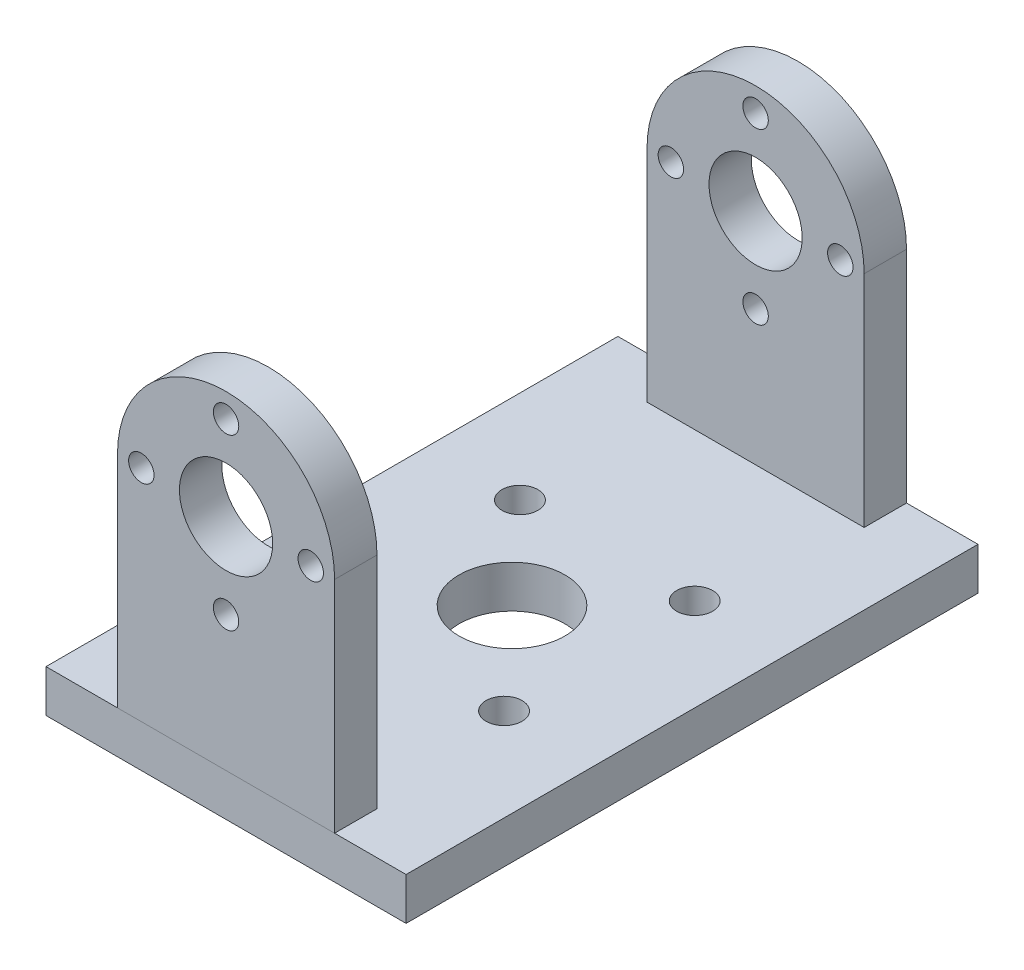
ISO-10303-21;
HEADER;
FILE_DESCRIPTION(('STEP AP214'),'2;1');
FILE_NAME('part.step','',(''),(''),'','','');
FILE_SCHEMA(('AUTOMOTIVE_DESIGN { 1 0 10303 214 1 1 1 1 }'));
ENDSEC;
DATA;
#1=APPLICATION_CONTEXT('core data for automotive mechanical design processes');
#2=APPLICATION_PROTOCOL_DEFINITION('international standard','automotive_design',2000,#1);
#3=PRODUCT_CONTEXT('',#1,'mechanical');
#4=PRODUCT('Part','Part','',(#3));
#5=PRODUCT_RELATED_PRODUCT_CATEGORY('part','',(#4));
#6=PRODUCT_DEFINITION_FORMATION('','',#4);
#7=PRODUCT_DEFINITION_CONTEXT('part definition',#1,'design');
#8=PRODUCT_DEFINITION('design','',#6,#7);
#9=PRODUCT_DEFINITION_SHAPE('','',#8);
#10=(LENGTH_UNIT() NAMED_UNIT(*) SI_UNIT(.MILLI.,.METRE.));
#11=(NAMED_UNIT(*) PLANE_ANGLE_UNIT() SI_UNIT($,.RADIAN.));
#12=(NAMED_UNIT(*) SI_UNIT($,.STERADIAN.) SOLID_ANGLE_UNIT());
#13=UNCERTAINTY_MEASURE_WITH_UNIT(LENGTH_MEASURE(1.E-05),#10,'distance_accuracy_value','');
#14=(GEOMETRIC_REPRESENTATION_CONTEXT(3) GLOBAL_UNCERTAINTY_ASSIGNED_CONTEXT((#13)) GLOBAL_UNIT_ASSIGNED_CONTEXT((#10,
#11,#12)) REPRESENTATION_CONTEXT('',''));
#15=CARTESIAN_POINT('',(0.,0.,0.));
#16=DIRECTION('',(0.,0.,1.));
#17=DIRECTION('',(1.,0.,0.));
#18=AXIS2_PLACEMENT_3D('',#15,#16,#17);
#19=CARTESIAN_POINT('',(0.,0.,50.));
#20=DIRECTION('',(0.,0.,1.));
#21=DIRECTION('',(1.,0.,0.));
#22=AXIS2_PLACEMENT_3D('',#19,#20,#21);
#23=PLANE('',#22);
#24=CARTESIAN_POINT('',(-8.,0.,50.));
#25=DIRECTION('',(0.,0.,1.));
#26=DIRECTION('',(1.,0.,0.));
#27=AXIS2_PLACEMENT_3D('',#24,#25,#26);
#28=CIRCLE('',#27,1.2);
#29=CARTESIAN_POINT('',(-6.8,0.,50.));
#30=VERTEX_POINT('',#29);
#31=EDGE_CURVE('E151',#30,#30,#28,.T.);
#32=ORIENTED_EDGE('',*,*,#31,.F.);
#33=EDGE_LOOP('',(#32));
#34=FACE_BOUND('',#33,.T.);
#35=CARTESIAN_POINT('',(8.,0.,50.));
#36=DIRECTION('',(0.,0.,1.));
#37=DIRECTION('',(1.,0.,0.));
#38=AXIS2_PLACEMENT_3D('',#35,#36,#37);
#39=CIRCLE('',#38,1.2);
#40=CARTESIAN_POINT('',(9.2,0.,50.));
#41=VERTEX_POINT('',#40);
#42=EDGE_CURVE('E139',#41,#41,#39,.T.);
#43=ORIENTED_EDGE('',*,*,#42,.F.);
#44=EDGE_LOOP('',(#43));
#45=FACE_BOUND('',#44,.T.);
#46=DIRECTION('',(0.,1.,0.));
#47=VECTOR('',#46,1.);
#48=CARTESIAN_POINT('',(10.25,-20.75,50.));
#49=LINE('',#48,#47);
#50=CARTESIAN_POINT('',(10.25,-20.75,50.));
#51=VERTEX_POINT('',#50);
#52=CARTESIAN_POINT('',(10.25,0.,50.));
#53=VERTEX_POINT('',#52);
#54=EDGE_CURVE('E109',#51,#53,#49,.T.);
#55=ORIENTED_EDGE('',*,*,#54,.T.);
#56=CARTESIAN_POINT('',(0.,0.,50.));
#57=DIRECTION('',(0.,0.,1.));
#58=DIRECTION('',(1.,0.,0.));
#59=AXIS2_PLACEMENT_3D('',#56,#57,#58);
#60=CIRCLE('',#59,10.25);
#61=CARTESIAN_POINT('',(-10.25,0.,50.));
#62=VERTEX_POINT('',#61);
#63=EDGE_CURVE('E104',#53,#62,#60,.T.);
#64=ORIENTED_EDGE('',*,*,#63,.T.);
#65=DIRECTION('',(0.,-1.,0.));
#66=VECTOR('',#65,1.);
#67=CARTESIAN_POINT('',(-10.25,-20.75,50.));
#68=LINE('',#67,#66);
#69=CARTESIAN_POINT('',(-10.25,-20.75,50.));
#70=VERTEX_POINT('',#69);
#71=EDGE_CURVE('E107',#62,#70,#68,.T.);
#72=ORIENTED_EDGE('',*,*,#71,.T.);
#73=DIRECTION('',(1.,0.,0.));
#74=VECTOR('',#73,1.);
#75=CARTESIAN_POINT('',(10.25,-20.75,50.));
#76=LINE('',#75,#74);
#77=EDGE_CURVE('E74',#70,#51,#76,.T.);
#78=ORIENTED_EDGE('',*,*,#77,.T.);
#79=EDGE_LOOP('',(#55,#64,#72,#78));
#80=FACE_BOUND('',#79,.T.);
#81=CARTESIAN_POINT('',(0.,0.,50.));
#82=DIRECTION('',(0.,0.,1.));
#83=DIRECTION('',(1.,0.,0.));
#84=AXIS2_PLACEMENT_3D('',#81,#82,#83);
#85=CIRCLE('',#84,4.4);
#86=CARTESIAN_POINT('',(4.4,0.,50.));
#87=VERTEX_POINT('',#86);
#88=EDGE_CURVE('E124',#87,#87,#85,.T.);
#89=ORIENTED_EDGE('',*,*,#88,.F.);
#90=EDGE_LOOP('',(#89));
#91=FACE_BOUND('',#90,.T.);
#92=CARTESIAN_POINT('',(0.,-8.,50.));
#93=DIRECTION('',(0.,0.,1.));
#94=DIRECTION('',(1.,0.,0.));
#95=AXIS2_PLACEMENT_3D('',#92,#93,#94);
#96=CIRCLE('',#95,1.2);
#97=CARTESIAN_POINT('',(1.19999999999995,-8.,50.));
#98=VERTEX_POINT('',#97);
#99=EDGE_CURVE('E145',#98,#98,#96,.T.);
#100=ORIENTED_EDGE('',*,*,#99,.F.);
#101=EDGE_LOOP('',(#100));
#102=FACE_BOUND('',#101,.T.);
#103=CARTESIAN_POINT('',(1.1172740284298E-13,8.,50.));
#104=DIRECTION('',(0.,0.,1.));
#105=DIRECTION('',(1.,0.,0.));
#106=AXIS2_PLACEMENT_3D('',#103,#104,#105);
#107=CIRCLE('',#106,1.2);
#108=CARTESIAN_POINT('',(1.20000000000011,8.,50.));
#109=VERTEX_POINT('',#108);
#110=EDGE_CURVE('E157',#109,#109,#107,.T.);
#111=ORIENTED_EDGE('',*,*,#110,.F.);
#112=EDGE_LOOP('',(#111));
#113=FACE_BOUND('',#112,.T.);
#114=ADVANCED_FACE('F57',(#34,#45,#80,#91,#102,#113),#23,.T.);
#115=CARTESIAN_POINT('',(0.,0.,46.));
#116=DIRECTION('',(0.,0.,1.));
#117=DIRECTION('',(1.,0.,0.));
#118=AXIS2_PLACEMENT_3D('',#115,#116,#117);
#119=PLANE('',#118);
#120=DIRECTION('',(0.,1.,0.));
#121=VECTOR('',#120,1.);
#122=CARTESIAN_POINT('',(10.25,-20.75,46.));
#123=LINE('',#122,#121);
#124=CARTESIAN_POINT('',(10.25,-20.75,46.));
#125=VERTEX_POINT('',#124);
#126=CARTESIAN_POINT('',(10.25,0.,46.));
#127=VERTEX_POINT('',#126);
#128=EDGE_CURVE('E121',#125,#127,#123,.T.);
#129=ORIENTED_EDGE('',*,*,#128,.F.);
#130=DIRECTION('',(1.,0.,0.));
#131=VECTOR('',#130,1.);
#132=CARTESIAN_POINT('',(10.25,-20.75,46.));
#133=LINE('',#132,#131);
#134=CARTESIAN_POINT('',(-10.25,-20.75,46.));
#135=VERTEX_POINT('',#134);
#136=EDGE_CURVE('E97',#135,#125,#133,.T.);
#137=ORIENTED_EDGE('',*,*,#136,.F.);
#138=DIRECTION('',(0.,-1.,0.));
#139=VECTOR('',#138,1.);
#140=CARTESIAN_POINT('',(-10.25,-20.75,46.));
#141=LINE('',#140,#139);
#142=CARTESIAN_POINT('',(-10.25,0.,46.));
#143=VERTEX_POINT('',#142);
#144=EDGE_CURVE('E91',#143,#135,#141,.T.);
#145=ORIENTED_EDGE('',*,*,#144,.F.);
#146=CARTESIAN_POINT('',(0.,0.,46.));
#147=DIRECTION('',(0.,0.,1.));
#148=DIRECTION('',(1.,0.,0.));
#149=AXIS2_PLACEMENT_3D('',#146,#147,#148);
#150=CIRCLE('',#149,10.25);
#151=EDGE_CURVE('E113',#127,#143,#150,.T.);
#152=ORIENTED_EDGE('',*,*,#151,.F.);
#153=EDGE_LOOP('',(#129,#137,#145,#152));
#154=FACE_BOUND('',#153,.T.);
#155=CARTESIAN_POINT('',(0.,0.,46.));
#156=DIRECTION('',(0.,0.,1.));
#157=DIRECTION('',(1.,0.,0.));
#158=AXIS2_PLACEMENT_3D('',#155,#156,#157);
#159=CIRCLE('',#158,4.4);
#160=CARTESIAN_POINT('',(4.4,0.,46.));
#161=VERTEX_POINT('',#160);
#162=EDGE_CURVE('E136',#161,#161,#159,.T.);
#163=ORIENTED_EDGE('',*,*,#162,.T.);
#164=EDGE_LOOP('',(#163));
#165=FACE_BOUND('',#164,.T.);
#166=CARTESIAN_POINT('',(8.,0.,46.));
#167=DIRECTION('',(0.,0.,1.));
#168=DIRECTION('',(1.,0.,0.));
#169=AXIS2_PLACEMENT_3D('',#166,#167,#168);
#170=CIRCLE('',#169,1.2);
#171=CARTESIAN_POINT('',(9.2,0.,46.));
#172=VERTEX_POINT('',#171);
#173=EDGE_CURVE('E142',#172,#172,#170,.T.);
#174=ORIENTED_EDGE('',*,*,#173,.T.);
#175=EDGE_LOOP('',(#174));
#176=FACE_BOUND('',#175,.T.);
#177=CARTESIAN_POINT('',(0.,-8.,46.));
#178=DIRECTION('',(0.,0.,1.));
#179=DIRECTION('',(1.,0.,0.));
#180=AXIS2_PLACEMENT_3D('',#177,#178,#179);
#181=CIRCLE('',#180,1.2);
#182=CARTESIAN_POINT('',(1.19999999999995,-8.,46.));
#183=VERTEX_POINT('',#182);
#184=EDGE_CURVE('E148',#183,#183,#181,.T.);
#185=ORIENTED_EDGE('',*,*,#184,.T.);
#186=EDGE_LOOP('',(#185));
#187=FACE_BOUND('',#186,.T.);
#188=CARTESIAN_POINT('',(-8.,0.,46.));
#189=DIRECTION('',(0.,0.,1.));
#190=DIRECTION('',(1.,0.,0.));
#191=AXIS2_PLACEMENT_3D('',#188,#189,#190);
#192=CIRCLE('',#191,1.2);
#193=CARTESIAN_POINT('',(-6.8,0.,46.));
#194=VERTEX_POINT('',#193);
#195=EDGE_CURVE('E154',#194,#194,#192,.T.);
#196=ORIENTED_EDGE('',*,*,#195,.T.);
#197=EDGE_LOOP('',(#196));
#198=FACE_BOUND('',#197,.T.);
#199=CARTESIAN_POINT('',(1.1172740284298E-13,8.,46.));
#200=DIRECTION('',(0.,0.,1.));
#201=DIRECTION('',(1.,0.,0.));
#202=AXIS2_PLACEMENT_3D('',#199,#200,#201);
#203=CIRCLE('',#202,1.2);
#204=CARTESIAN_POINT('',(1.20000000000011,8.,46.));
#205=VERTEX_POINT('',#204);
#206=EDGE_CURVE('E160',#205,#205,#203,.T.);
#207=ORIENTED_EDGE('',*,*,#206,.T.);
#208=EDGE_LOOP('',(#207));
#209=FACE_BOUND('',#208,.T.);
#210=ADVANCED_FACE('F132',(#154,#165,#176,#187,#198,#209),#119,.F.);
#211=CARTESIAN_POINT('',(10.25,-20.75,50.));
#212=DIRECTION('',(-1.,0.,0.));
#213=DIRECTION('',(0.,0.,1.));
#214=AXIS2_PLACEMENT_3D('',#211,#212,#213);
#215=PLANE('',#214);
#216=ORIENTED_EDGE('',*,*,#128,.T.);
#217=DIRECTION('',(0.,0.,-1.));
#218=VECTOR('',#217,1.);
#219=CARTESIAN_POINT('',(10.25,0.,50.));
#220=LINE('',#219,#218);
#221=EDGE_CURVE('E12',#53,#127,#220,.T.);
#222=ORIENTED_EDGE('',*,*,#221,.F.);
#223=ORIENTED_EDGE('',*,*,#54,.F.);
#224=DIRECTION('',(0.,0.,-1.));
#225=VECTOR('',#224,1.);
#226=CARTESIAN_POINT('',(10.25,-20.75,50.));
#227=LINE('',#226,#225);
#228=EDGE_CURVE('E117',#51,#125,#227,.T.);
#229=ORIENTED_EDGE('',*,*,#228,.T.);
#230=EDGE_LOOP('',(#216,#222,#223,#229));
#231=FACE_BOUND('',#230,.T.);
#232=ADVANCED_FACE('F59',(#231),#215,.F.);
#233=CARTESIAN_POINT('',(0.,0.,50.));
#234=DIRECTION('',(0.,0.,-1.));
#235=DIRECTION('',(-1.,0.,0.));
#236=AXIS2_PLACEMENT_3D('',#233,#234,#235);
#237=CYLINDRICAL_SURFACE('',#236,10.25);
#238=ORIENTED_EDGE('',*,*,#151,.T.);
#239=DIRECTION('',(0.,0.,-1.));
#240=VECTOR('',#239,1.);
#241=CARTESIAN_POINT('',(-10.25,0.,50.));
#242=LINE('',#241,#240);
#243=EDGE_CURVE('E66',#62,#143,#242,.T.);
#244=ORIENTED_EDGE('',*,*,#243,.F.);
#245=ORIENTED_EDGE('',*,*,#63,.F.);
#246=ORIENTED_EDGE('',*,*,#221,.T.);
#247=EDGE_LOOP('',(#238,#244,#245,#246));
#248=FACE_BOUND('',#247,.T.);
#249=ADVANCED_FACE('F112',(#248),#237,.T.);
#250=CARTESIAN_POINT('',(-10.25,-20.75,50.));
#251=DIRECTION('',(1.,0.,0.));
#252=DIRECTION('',(0.,0.,-1.));
#253=AXIS2_PLACEMENT_3D('',#250,#251,#252);
#254=PLANE('',#253);
#255=ORIENTED_EDGE('',*,*,#144,.T.);
#256=DIRECTION('',(0.,0.,-1.));
#257=VECTOR('',#256,1.);
#258=CARTESIAN_POINT('',(-10.25,-20.75,50.));
#259=LINE('',#258,#257);
#260=EDGE_CURVE('E114',#70,#135,#259,.T.);
#261=ORIENTED_EDGE('',*,*,#260,.F.);
#262=ORIENTED_EDGE('',*,*,#71,.F.);
#263=ORIENTED_EDGE('',*,*,#243,.T.);
#264=EDGE_LOOP('',(#255,#261,#262,#263));
#265=FACE_BOUND('',#264,.T.);
#266=ADVANCED_FACE('F115',(#265),#254,.F.);
#267=CARTESIAN_POINT('',(10.25,-20.75,50.));
#268=DIRECTION('',(0.,1.,0.));
#269=DIRECTION('',(0.,0.,1.));
#270=AXIS2_PLACEMENT_3D('',#267,#268,#269);
#271=PLANE('',#270);
#272=ORIENTED_EDGE('',*,*,#136,.T.);
#273=ORIENTED_EDGE('',*,*,#228,.F.);
#274=ORIENTED_EDGE('',*,*,#77,.F.);
#275=ORIENTED_EDGE('',*,*,#260,.T.);
#276=EDGE_LOOP('',(#272,#273,#274,#275));
#277=FACE_BOUND('',#276,.T.);
#278=ADVANCED_FACE('F129',(#277),#271,.F.);
#279=CARTESIAN_POINT('',(0.,0.,50.));
#280=DIRECTION('',(0.,0.,-1.));
#281=DIRECTION('',(-1.,0.,0.));
#282=AXIS2_PLACEMENT_3D('',#279,#280,#281);
#283=CYLINDRICAL_SURFACE('',#282,4.4);
#284=ORIENTED_EDGE('',*,*,#88,.T.);
#285=EDGE_LOOP('',(#284));
#286=FACE_BOUND('',#285,.T.);
#287=ORIENTED_EDGE('',*,*,#162,.F.);
#288=EDGE_LOOP('',(#287));
#289=FACE_BOUND('',#288,.T.);
#290=ADVANCED_FACE('F180',(#286,#289),#283,.F.);
#291=CARTESIAN_POINT('',(8.,0.,50.));
#292=DIRECTION('',(0.,0.,-1.));
#293=DIRECTION('',(-1.,0.,0.));
#294=AXIS2_PLACEMENT_3D('',#291,#292,#293);
#295=CYLINDRICAL_SURFACE('',#294,1.2);
#296=ORIENTED_EDGE('',*,*,#42,.T.);
#297=EDGE_LOOP('',(#296));
#298=FACE_BOUND('',#297,.T.);
#299=ORIENTED_EDGE('',*,*,#173,.F.);
#300=EDGE_LOOP('',(#299));
#301=FACE_BOUND('',#300,.T.);
#302=ADVANCED_FACE('F209',(#298,#301),#295,.F.);
#303=CARTESIAN_POINT('',(0.,-8.,50.));
#304=DIRECTION('',(0.,0.,-1.));
#305=DIRECTION('',(-1.,0.,0.));
#306=AXIS2_PLACEMENT_3D('',#303,#304,#305);
#307=CYLINDRICAL_SURFACE('',#306,1.2);
#308=ORIENTED_EDGE('',*,*,#99,.T.);
#309=EDGE_LOOP('',(#308));
#310=FACE_BOUND('',#309,.T.);
#311=ORIENTED_EDGE('',*,*,#184,.F.);
#312=EDGE_LOOP('',(#311));
#313=FACE_BOUND('',#312,.T.);
#314=ADVANCED_FACE('F217',(#310,#313),#307,.F.);
#315=CARTESIAN_POINT('',(-8.,0.,50.));
#316=DIRECTION('',(0.,0.,-1.));
#317=DIRECTION('',(-1.,0.,0.));
#318=AXIS2_PLACEMENT_3D('',#315,#316,#317);
#319=CYLINDRICAL_SURFACE('',#318,1.2);
#320=ORIENTED_EDGE('',*,*,#31,.T.);
#321=EDGE_LOOP('',(#320));
#322=FACE_BOUND('',#321,.T.);
#323=ORIENTED_EDGE('',*,*,#195,.F.);
#324=EDGE_LOOP('',(#323));
#325=FACE_BOUND('',#324,.T.);
#326=ADVANCED_FACE('F225',(#322,#325),#319,.F.);
#327=CARTESIAN_POINT('',(1.1172740284298E-13,8.,50.));
#328=DIRECTION('',(0.,0.,-1.));
#329=DIRECTION('',(-1.,0.,0.));
#330=AXIS2_PLACEMENT_3D('',#327,#328,#329);
#331=CYLINDRICAL_SURFACE('',#330,1.2);
#332=ORIENTED_EDGE('',*,*,#110,.T.);
#333=EDGE_LOOP('',(#332));
#334=FACE_BOUND('',#333,.T.);
#335=ORIENTED_EDGE('',*,*,#206,.F.);
#336=EDGE_LOOP('',(#335));
#337=FACE_BOUND('',#336,.T.);
#338=ADVANCED_FACE('F166',(#334,#337),#331,.F.);
#339=CLOSED_SHELL('',(#114,#210,#232,#249,#266,#278,#290,#302,#314,#326,#338));
#340=MANIFOLD_SOLID_BREP('B2',#339);
#341=CARTESIAN_POINT('',(0.,-20.75,0.));
#342=DIRECTION('',(0.,1.,0.));
#343=DIRECTION('',(-1.,0.,0.));
#344=AXIS2_PLACEMENT_3D('',#341,#342,#343);
#345=PLANE('',#344);
#346=DIRECTION('',(0.,0.,-1.));
#347=VECTOR('',#346,1.);
#348=CARTESIAN_POINT('',(17.,-20.75,0.));
#349=LINE('',#348,#347);
#350=CARTESIAN_POINT('',(17.,-20.75,50.));
#351=VERTEX_POINT('',#350);
#352=CARTESIAN_POINT('',(17.,-20.75,-4.));
#353=VERTEX_POINT('',#352);
#354=EDGE_CURVE('E323',#351,#353,#349,.T.);
#355=ORIENTED_EDGE('',*,*,#354,.T.);
#356=DIRECTION('',(-1.,0.,0.));
#357=VECTOR('',#356,1.);
#358=CARTESIAN_POINT('',(-17.,-20.75,-4.));
#359=LINE('',#358,#357);
#360=CARTESIAN_POINT('',(10.25,-20.75,-4.));
#361=VERTEX_POINT('',#360);
#362=EDGE_CURVE('E352',#353,#361,#359,.T.);
#363=ORIENTED_EDGE('',*,*,#362,.T.);
#364=DIRECTION('',(0.,0.,1.));
#365=VECTOR('',#364,1.);
#366=CARTESIAN_POINT('',(10.25,-20.75,0.));
#367=LINE('',#366,#365);
#368=CARTESIAN_POINT('',(10.25,-20.75,0.));
#369=VERTEX_POINT('',#368);
#370=EDGE_CURVE('E300',#361,#369,#367,.T.);
#371=ORIENTED_EDGE('',*,*,#370,.T.);
#372=DIRECTION('',(1.,0.,0.));
#373=VECTOR('',#372,1.);
#374=CARTESIAN_POINT('',(-17.,-20.75,0.));
#375=LINE('',#374,#373);
#376=CARTESIAN_POINT('',(-10.25,-20.75,0.));
#377=VERTEX_POINT('',#376);
#378=EDGE_CURVE('E823',#377,#369,#375,.T.);
#379=ORIENTED_EDGE('',*,*,#378,.F.);
#380=DIRECTION('',(0.,0.,-1.));
#381=VECTOR('',#380,1.);
#382=CARTESIAN_POINT('',(-10.25,-20.75,0.));
#383=LINE('',#382,#381);
#384=CARTESIAN_POINT('',(-10.25,-20.75,-4.));
#385=VERTEX_POINT('',#384);
#386=EDGE_CURVE('E394',#377,#385,#383,.T.);
#387=ORIENTED_EDGE('',*,*,#386,.T.);
#388=CARTESIAN_POINT('',(-17.,-20.75,-4.));
#389=VERTEX_POINT('',#388);
#390=EDGE_CURVE('E357',#385,#389,#359,.T.);
#391=ORIENTED_EDGE('',*,*,#390,.T.);
#392=DIRECTION('',(0.,0.,1.));
#393=VECTOR('',#392,1.);
#394=CARTESIAN_POINT('',(-17.,-20.75,0.));
#395=LINE('',#394,#393);
#396=CARTESIAN_POINT('',(-17.,-20.75,50.));
#397=VERTEX_POINT('',#396);
#398=EDGE_CURVE('E349',#389,#397,#395,.T.);
#399=ORIENTED_EDGE('',*,*,#398,.T.);
#400=DIRECTION('',(1.,0.,0.));
#401=VECTOR('',#400,1.);
#402=CARTESIAN_POINT('',(-17.,-20.75,50.));
#403=LINE('',#402,#401);
#404=EDGE_CURVE('E340',#397,#351,#403,.T.);
#405=ORIENTED_EDGE('',*,*,#404,.T.);
#406=EDGE_LOOP('',(#355,#363,#371,#379,#387,#391,#399,#405));
#407=FACE_BOUND('',#406,.T.);
#408=CARTESIAN_POINT('',(8.25,-20.75,14.));
#409=DIRECTION('',(0.,1.,0.));
#410=DIRECTION('',(-1.,0.,0.));
#411=AXIS2_PLACEMENT_3D('',#408,#409,#410);
#412=CIRCLE('',#411,1.7);
#413=CARTESIAN_POINT('',(6.55,-20.75,14.));
#414=VERTEX_POINT('',#413);
#415=EDGE_CURVE('E385',#414,#414,#412,.F.);
#416=ORIENTED_EDGE('',*,*,#415,.T.);
#417=EDGE_LOOP('',(#416));
#418=FACE_BOUND('',#417,.T.);
#419=CARTESIAN_POINT('',(-8.25000000000019,-20.75,32.));
#420=DIRECTION('',(0.,1.,0.));
#421=DIRECTION('',(-1.,0.,0.));
#422=AXIS2_PLACEMENT_3D('',#419,#420,#421);
#423=CIRCLE('',#422,1.7);
#424=CARTESIAN_POINT('',(-9.95000000000019,-20.75,32.));
#425=VERTEX_POINT('',#424);
#426=EDGE_CURVE('E334',#425,#425,#423,.F.);
#427=ORIENTED_EDGE('',*,*,#426,.T.);
#428=EDGE_LOOP('',(#427));
#429=FACE_BOUND('',#428,.T.);
#430=CARTESIAN_POINT('',(8.24999999999981,-20.75,32.));
#431=DIRECTION('',(0.,1.,0.));
#432=DIRECTION('',(-1.,0.,0.));
#433=AXIS2_PLACEMENT_3D('',#430,#431,#432);
#434=CIRCLE('',#433,1.7);
#435=CARTESIAN_POINT('',(6.54999999999981,-20.75,32.));
#436=VERTEX_POINT('',#435);
#437=EDGE_CURVE('E400',#436,#436,#434,.F.);
#438=ORIENTED_EDGE('',*,*,#437,.T.);
#439=EDGE_LOOP('',(#438));
#440=FACE_BOUND('',#439,.T.);
#441=CARTESIAN_POINT('',(-8.25,-20.75,14.));
#442=DIRECTION('',(0.,1.,0.));
#443=DIRECTION('',(-1.,0.,0.));
#444=AXIS2_PLACEMENT_3D('',#441,#442,#443);
#445=CIRCLE('',#444,1.7);
#446=CARTESIAN_POINT('',(-9.95,-20.75,14.));
#447=VERTEX_POINT('',#446);
#448=EDGE_CURVE('E404',#447,#447,#445,.F.);
#449=ORIENTED_EDGE('',*,*,#448,.T.);
#450=EDGE_LOOP('',(#449));
#451=FACE_BOUND('',#450,.T.);
#452=CARTESIAN_POINT('',(0.,-20.75,23.));
#453=DIRECTION('',(0.,1.,0.));
#454=DIRECTION('',(-1.,0.,0.));
#455=AXIS2_PLACEMENT_3D('',#452,#453,#454);
#456=CIRCLE('',#455,5.);
#457=CARTESIAN_POINT('',(-5.00000000000001,-20.75,23.));
#458=VERTEX_POINT('',#457);
#459=EDGE_CURVE('E408',#458,#458,#456,.F.);
#460=ORIENTED_EDGE('',*,*,#459,.T.);
#461=EDGE_LOOP('',(#460));
#462=FACE_BOUND('',#461,.T.);
#463=ADVANCED_FACE('F282',(#407,#418,#429,#440,#451,#462),#345,.T.);
#464=CARTESIAN_POINT('',(17.,-24.75,0.));
#465=DIRECTION('',(0.,1.,0.));
#466=DIRECTION('',(-1.,0.,0.));
#467=AXIS2_PLACEMENT_3D('',#464,#465,#466);
#468=PLANE('',#467);
#469=DIRECTION('',(-1.,0.,0.));
#470=VECTOR('',#469,1.);
#471=CARTESIAN_POINT('',(-17.,-24.75,-4.));
#472=LINE('',#471,#470);
#473=CARTESIAN_POINT('',(17.,-24.75,-4.));
#474=VERTEX_POINT('',#473);
#475=CARTESIAN_POINT('',(-17.,-24.75,-4.));
#476=VERTEX_POINT('',#475);
#477=EDGE_CURVE('E533',#474,#476,#472,.T.);
#478=ORIENTED_EDGE('',*,*,#477,.F.);
#479=DIRECTION('',(0.,0.,-1.));
#480=VECTOR('',#479,1.);
#481=CARTESIAN_POINT('',(17.,-24.75,0.));
#482=LINE('',#481,#480);
#483=CARTESIAN_POINT('',(17.,-24.75,50.));
#484=VERTEX_POINT('',#483);
#485=EDGE_CURVE('E309',#484,#474,#482,.T.);
#486=ORIENTED_EDGE('',*,*,#485,.F.);
#487=DIRECTION('',(1.,0.,0.));
#488=VECTOR('',#487,1.);
#489=CARTESIAN_POINT('',(-17.,-24.75,50.));
#490=LINE('',#489,#488);
#491=CARTESIAN_POINT('',(-17.,-24.75,50.));
#492=VERTEX_POINT('',#491);
#493=EDGE_CURVE('E341',#492,#484,#490,.T.);
#494=ORIENTED_EDGE('',*,*,#493,.F.);
#495=DIRECTION('',(0.,0.,-1.));
#496=VECTOR('',#495,1.);
#497=CARTESIAN_POINT('',(-17.,-24.75,0.));
#498=LINE('',#497,#496);
#499=EDGE_CURVE('E343',#492,#476,#498,.T.);
#500=ORIENTED_EDGE('',*,*,#499,.T.);
#501=EDGE_LOOP('',(#478,#486,#494,#500));
#502=FACE_BOUND('',#501,.T.);
#503=CARTESIAN_POINT('',(0.,-24.75,23.));
#504=DIRECTION('',(0.,1.,0.));
#505=DIRECTION('',(-1.,0.,0.));
#506=AXIS2_PLACEMENT_3D('',#503,#504,#505);
#507=CIRCLE('',#506,5.);
#508=CARTESIAN_POINT('',(-5.,-24.75,23.));
#509=VERTEX_POINT('',#508);
#510=EDGE_CURVE('E381',#509,#509,#507,.F.);
#511=ORIENTED_EDGE('',*,*,#510,.F.);
#512=EDGE_LOOP('',(#511));
#513=FACE_BOUND('',#512,.T.);
#514=CARTESIAN_POINT('',(-8.25,-24.75,14.));
#515=DIRECTION('',(0.,1.,0.));
#516=DIRECTION('',(-1.,0.,0.));
#517=AXIS2_PLACEMENT_3D('',#514,#515,#516);
#518=CIRCLE('',#517,1.7);
#519=CARTESIAN_POINT('',(-9.95,-24.75,14.));
#520=VERTEX_POINT('',#519);
#521=EDGE_CURVE('E373',#520,#520,#518,.F.);
#522=ORIENTED_EDGE('',*,*,#521,.F.);
#523=EDGE_LOOP('',(#522));
#524=FACE_BOUND('',#523,.T.);
#525=CARTESIAN_POINT('',(8.24999999999981,-24.75,32.));
#526=DIRECTION('',(0.,1.,0.));
#527=DIRECTION('',(-1.,0.,0.));
#528=AXIS2_PLACEMENT_3D('',#525,#526,#527);
#529=CIRCLE('',#528,1.7);
#530=CARTESIAN_POINT('',(6.54999999999981,-24.75,32.));
#531=VERTEX_POINT('',#530);
#532=EDGE_CURVE('E365',#531,#531,#529,.F.);
#533=ORIENTED_EDGE('',*,*,#532,.F.);
#534=EDGE_LOOP('',(#533));
#535=FACE_BOUND('',#534,.T.);
#536=CARTESIAN_POINT('',(-8.25000000000019,-24.75,32.));
#537=DIRECTION('',(0.,1.,0.));
#538=DIRECTION('',(-1.,0.,0.));
#539=AXIS2_PLACEMENT_3D('',#536,#537,#538);
#540=CIRCLE('',#539,1.7);
#541=CARTESIAN_POINT('',(-9.95000000000019,-24.75,32.));
#542=VERTEX_POINT('',#541);
#543=EDGE_CURVE('E369',#542,#542,#540,.F.);
#544=ORIENTED_EDGE('',*,*,#543,.F.);
#545=EDGE_LOOP('',(#544));
#546=FACE_BOUND('',#545,.T.);
#547=CARTESIAN_POINT('',(8.25,-24.75,14.));
#548=DIRECTION('',(0.,1.,0.));
#549=DIRECTION('',(-1.,0.,0.));
#550=AXIS2_PLACEMENT_3D('',#547,#548,#549);
#551=CIRCLE('',#550,1.7);
#552=CARTESIAN_POINT('',(6.55,-24.75,14.));
#553=VERTEX_POINT('',#552);
#554=EDGE_CURVE('E377',#553,#553,#551,.F.);
#555=ORIENTED_EDGE('',*,*,#554,.F.);
#556=EDGE_LOOP('',(#555));
#557=FACE_BOUND('',#556,.T.);
#558=ADVANCED_FACE('F421',(#502,#513,#524,#535,#546,#557),#468,.F.);
#559=CARTESIAN_POINT('',(10.25,0.,4.));
#560=DIRECTION('',(1.,0.,0.));
#561=DIRECTION('',(0.,1.,0.));
#562=AXIS2_PLACEMENT_3D('',#559,#560,#561);
#563=PLANE('',#562);
#564=DIRECTION('',(0.,1.,0.));
#565=VECTOR('',#564,1.);
#566=CARTESIAN_POINT('',(10.25,0.,0.));
#567=LINE('',#566,#565);
#568=CARTESIAN_POINT('',(10.25,0.,0.));
#569=VERTEX_POINT('',#568);
#570=EDGE_CURVE('E507',#369,#569,#567,.T.);
#571=ORIENTED_EDGE('',*,*,#570,.F.);
#572=ORIENTED_EDGE('',*,*,#370,.F.);
#573=DIRECTION('',(0.,-1.,0.));
#574=VECTOR('',#573,1.);
#575=CARTESIAN_POINT('',(10.25,0.,-4.));
#576=LINE('',#575,#574);
#577=CARTESIAN_POINT('',(10.25,0.,-4.));
#578=VERTEX_POINT('',#577);
#579=EDGE_CURVE('E518',#578,#361,#576,.T.);
#580=ORIENTED_EDGE('',*,*,#579,.F.);
#581=DIRECTION('',(0.,0.,-1.));
#582=VECTOR('',#581,1.);
#583=CARTESIAN_POINT('',(10.25,0.,4.));
#584=LINE('',#583,#582);
#585=EDGE_CURVE('E55',#569,#578,#584,.T.);
#586=ORIENTED_EDGE('',*,*,#585,.F.);
#587=EDGE_LOOP('',(#571,#572,#580,#586));
#588=FACE_BOUND('',#587,.T.);
#589=ADVANCED_FACE('F424',(#588),#563,.T.);
#590=CARTESIAN_POINT('',(-10.25,0.,4.));
#591=DIRECTION('',(1.,0.,0.));
#592=DIRECTION('',(0.,1.,0.));
#593=AXIS2_PLACEMENT_3D('',#590,#591,#592);
#594=PLANE('',#593);
#595=ORIENTED_EDGE('',*,*,#386,.F.);
#596=DIRECTION('',(0.,1.,0.));
#597=VECTOR('',#596,1.);
#598=CARTESIAN_POINT('',(-10.25,0.,0.));
#599=LINE('',#598,#597);
#600=CARTESIAN_POINT('',(-10.25,0.,0.));
#601=VERTEX_POINT('',#600);
#602=EDGE_CURVE('E841',#377,#601,#599,.T.);
#603=ORIENTED_EDGE('',*,*,#602,.T.);
#604=DIRECTION('',(0.,0.,-1.));
#605=VECTOR('',#604,1.);
#606=CARTESIAN_POINT('',(-10.25,0.,4.));
#607=LINE('',#606,#605);
#608=CARTESIAN_POINT('',(-10.25,0.,-4.));
#609=VERTEX_POINT('',#608);
#610=EDGE_CURVE('E292',#601,#609,#607,.T.);
#611=ORIENTED_EDGE('',*,*,#610,.T.);
#612=DIRECTION('',(0.,-1.,0.));
#613=VECTOR('',#612,1.);
#614=CARTESIAN_POINT('',(-10.25,0.,-4.));
#615=LINE('',#614,#613);
#616=EDGE_CURVE('E522',#609,#385,#615,.T.);
#617=ORIENTED_EDGE('',*,*,#616,.T.);
#618=EDGE_LOOP('',(#595,#603,#611,#617));
#619=FACE_BOUND('',#618,.T.);
#620=ADVANCED_FACE('F461',(#619),#594,.F.);
#621=CARTESIAN_POINT('',(0.,0.,4.));
#622=DIRECTION('',(0.,0.,-1.));
#623=DIRECTION('',(-1.,0.,0.));
#624=AXIS2_PLACEMENT_3D('',#621,#622,#623);
#625=CYLINDRICAL_SURFACE('',#624,10.25);
#626=CARTESIAN_POINT('',(0.,0.,0.));
#627=DIRECTION('',(0.,0.,-1.));
#628=DIRECTION('',(-1.,0.,0.));
#629=AXIS2_PLACEMENT_3D('',#626,#627,#628);
#630=CIRCLE('',#629,10.25);
#631=EDGE_CURVE('E837',#601,#569,#630,.T.);
#632=ORIENTED_EDGE('',*,*,#631,.T.);
#633=ORIENTED_EDGE('',*,*,#585,.T.);
#634=CARTESIAN_POINT('',(0.,0.,-4.));
#635=DIRECTION('',(0.,0.,1.));
#636=DIRECTION('',(1.,0.,0.));
#637=AXIS2_PLACEMENT_3D('',#634,#635,#636);
#638=CIRCLE('',#637,10.25);
#639=EDGE_CURVE('E526',#578,#609,#638,.T.);
#640=ORIENTED_EDGE('',*,*,#639,.T.);
#641=ORIENTED_EDGE('',*,*,#610,.F.);
#642=EDGE_LOOP('',(#632,#633,#640,#641));
#643=FACE_BOUND('',#642,.T.);
#644=ADVANCED_FACE('F464',(#643),#625,.T.);
#645=CARTESIAN_POINT('',(-8.,0.,4.));
#646=DIRECTION('',(0.,0.,-1.));
#647=DIRECTION('',(-1.,0.,0.));
#648=AXIS2_PLACEMENT_3D('',#645,#646,#647);
#649=CYLINDRICAL_SURFACE('',#648,1.2);
#650=CARTESIAN_POINT('',(-8.,0.,0.));
#651=DIRECTION('',(0.,0.,-1.));
#652=DIRECTION('',(-1.,0.,0.));
#653=AXIS2_PLACEMENT_3D('',#650,#651,#652);
#654=CIRCLE('',#653,1.2);
#655=CARTESIAN_POINT('',(-9.2,0.,0.));
#656=VERTEX_POINT('',#655);
#657=EDGE_CURVE('E810',#656,#656,#654,.T.);
#658=ORIENTED_EDGE('',*,*,#657,.F.);
#659=EDGE_LOOP('',(#658));
#660=FACE_BOUND('',#659,.T.);
#661=CARTESIAN_POINT('',(-8.,0.,-4.));
#662=DIRECTION('',(0.,0.,1.));
#663=DIRECTION('',(1.,0.,0.));
#664=AXIS2_PLACEMENT_3D('',#661,#662,#663);
#665=CIRCLE('',#664,1.2);
#666=CARTESIAN_POINT('',(-6.8,0.,-4.));
#667=VERTEX_POINT('',#666);
#668=EDGE_CURVE('E514',#667,#667,#665,.T.);
#669=ORIENTED_EDGE('',*,*,#668,.F.);
#670=EDGE_LOOP('',(#669));
#671=FACE_BOUND('',#670,.T.);
#672=ADVANCED_FACE('F468',(#660,#671),#649,.F.);
#673=CARTESIAN_POINT('',(0.,0.,4.));
#674=DIRECTION('',(0.,0.,-1.));
#675=DIRECTION('',(-1.,0.,0.));
#676=AXIS2_PLACEMENT_3D('',#673,#674,#675);
#677=CYLINDRICAL_SURFACE('',#676,4.4);
#678=CARTESIAN_POINT('',(0.,0.,0.));
#679=DIRECTION('',(0.,0.,-1.));
#680=DIRECTION('',(-1.,0.,0.));
#681=AXIS2_PLACEMENT_3D('',#678,#679,#680);
#682=CIRCLE('',#681,4.4);
#683=CARTESIAN_POINT('',(-4.4,0.,0.));
#684=VERTEX_POINT('',#683);
#685=EDGE_CURVE('E814',#684,#684,#682,.T.);
#686=ORIENTED_EDGE('',*,*,#685,.F.);
#687=EDGE_LOOP('',(#686));
#688=FACE_BOUND('',#687,.T.);
#689=CARTESIAN_POINT('',(0.,0.,-4.));
#690=DIRECTION('',(0.,0.,1.));
#691=DIRECTION('',(1.,0.,0.));
#692=AXIS2_PLACEMENT_3D('',#689,#690,#691);
#693=CIRCLE('',#692,4.4);
#694=CARTESIAN_POINT('',(4.4,0.,-4.));
#695=VERTEX_POINT('',#694);
#696=EDGE_CURVE('E504',#695,#695,#693,.T.);
#697=ORIENTED_EDGE('',*,*,#696,.F.);
#698=EDGE_LOOP('',(#697));
#699=FACE_BOUND('',#698,.T.);
#700=ADVANCED_FACE('F474',(#688,#699),#677,.F.);
#701=CARTESIAN_POINT('',(0.,8.,4.));
#702=DIRECTION('',(0.,0.,-1.));
#703=DIRECTION('',(-1.,0.,0.));
#704=AXIS2_PLACEMENT_3D('',#701,#702,#703);
#705=CYLINDRICAL_SURFACE('',#704,1.2);
#706=CARTESIAN_POINT('',(0.,8.,0.));
#707=DIRECTION('',(0.,0.,-1.));
#708=DIRECTION('',(-1.,0.,0.));
#709=AXIS2_PLACEMENT_3D('',#706,#707,#708);
#710=CIRCLE('',#709,1.2);
#711=CARTESIAN_POINT('',(-1.2,8.,0.));
#712=VERTEX_POINT('',#711);
#713=EDGE_CURVE('E818',#712,#712,#710,.T.);
#714=ORIENTED_EDGE('',*,*,#713,.F.);
#715=EDGE_LOOP('',(#714));
#716=FACE_BOUND('',#715,.T.);
#717=CARTESIAN_POINT('',(0.,8.,-4.));
#718=DIRECTION('',(0.,0.,1.));
#719=DIRECTION('',(1.,0.,0.));
#720=AXIS2_PLACEMENT_3D('',#717,#718,#719);
#721=CIRCLE('',#720,1.2);
#722=CARTESIAN_POINT('',(1.2,8.,-4.));
#723=VERTEX_POINT('',#722);
#724=EDGE_CURVE('E498',#723,#723,#721,.T.);
#725=ORIENTED_EDGE('',*,*,#724,.F.);
#726=EDGE_LOOP('',(#725));
#727=FACE_BOUND('',#726,.T.);
#728=ADVANCED_FACE('F478',(#716,#727),#705,.F.);
#729=CARTESIAN_POINT('',(8.,0.,4.));
#730=DIRECTION('',(0.,0.,-1.));
#731=DIRECTION('',(-1.,0.,0.));
#732=AXIS2_PLACEMENT_3D('',#729,#730,#731);
#733=CYLINDRICAL_SURFACE('',#732,1.2);
#734=CARTESIAN_POINT('',(8.,0.,0.));
#735=DIRECTION('',(0.,0.,-1.));
#736=DIRECTION('',(-1.,0.,0.));
#737=AXIS2_PLACEMENT_3D('',#734,#735,#736);
#738=CIRCLE('',#737,1.2);
#739=CARTESIAN_POINT('',(6.8,0.,0.));
#740=VERTEX_POINT('',#739);
#741=EDGE_CURVE('E492',#740,#740,#738,.T.);
#742=ORIENTED_EDGE('',*,*,#741,.F.);
#743=EDGE_LOOP('',(#742));
#744=FACE_BOUND('',#743,.T.);
#745=CARTESIAN_POINT('',(8.,0.,-4.));
#746=DIRECTION('',(0.,0.,1.));
#747=DIRECTION('',(1.,0.,0.));
#748=AXIS2_PLACEMENT_3D('',#745,#746,#747);
#749=CIRCLE('',#748,1.2);
#750=CARTESIAN_POINT('',(9.2,0.,-4.));
#751=VERTEX_POINT('',#750);
#752=EDGE_CURVE('E495',#751,#751,#749,.T.);
#753=ORIENTED_EDGE('',*,*,#752,.F.);
#754=EDGE_LOOP('',(#753));
#755=FACE_BOUND('',#754,.T.);
#756=ADVANCED_FACE('F481',(#744,#755),#733,.F.);
#757=CARTESIAN_POINT('',(0.,-8.,4.));
#758=DIRECTION('',(0.,0.,-1.));
#759=DIRECTION('',(-1.,0.,0.));
#760=AXIS2_PLACEMENT_3D('',#757,#758,#759);
#761=CYLINDRICAL_SURFACE('',#760,1.2);
#762=CARTESIAN_POINT('',(0.,-8.,0.));
#763=DIRECTION('',(0.,0.,-1.));
#764=DIRECTION('',(-1.,0.,0.));
#765=AXIS2_PLACEMENT_3D('',#762,#763,#764);
#766=CIRCLE('',#765,1.2);
#767=CARTESIAN_POINT('',(-1.20000000000006,-8.,0.));
#768=VERTEX_POINT('',#767);
#769=EDGE_CURVE('E286',#768,#768,#766,.T.);
#770=ORIENTED_EDGE('',*,*,#769,.F.);
#771=EDGE_LOOP('',(#770));
#772=FACE_BOUND('',#771,.T.);
#773=CARTESIAN_POINT('',(0.,-8.,-4.));
#774=DIRECTION('',(0.,0.,1.));
#775=DIRECTION('',(1.,0.,0.));
#776=AXIS2_PLACEMENT_3D('',#773,#774,#775);
#777=CIRCLE('',#776,1.2);
#778=CARTESIAN_POINT('',(1.19999999999994,-8.,-4.));
#779=VERTEX_POINT('',#778);
#780=EDGE_CURVE('E499',#779,#779,#777,.T.);
#781=ORIENTED_EDGE('',*,*,#780,.F.);
#782=EDGE_LOOP('',(#781));
#783=FACE_BOUND('',#782,.T.);
#784=ADVANCED_FACE('F284',(#772,#783),#761,.F.);
#785=CARTESIAN_POINT('',(17.,-24.75,0.));
#786=DIRECTION('',(1.,0.,0.));
#787=DIRECTION('',(0.,0.,-1.));
#788=AXIS2_PLACEMENT_3D('',#785,#786,#787);
#789=PLANE('',#788);
#790=ORIENTED_EDGE('',*,*,#485,.T.);
#791=DIRECTION('',(0.,1.,0.));
#792=VECTOR('',#791,1.);
#793=CARTESIAN_POINT('',(17.,-24.75,-4.));
#794=LINE('',#793,#792);
#795=EDGE_CURVE('E329',#474,#353,#794,.T.);
#796=ORIENTED_EDGE('',*,*,#795,.T.);
#797=ORIENTED_EDGE('',*,*,#354,.F.);
#798=DIRECTION('',(0.,1.,0.));
#799=VECTOR('',#798,1.);
#800=CARTESIAN_POINT('',(17.,-24.75,50.));
#801=LINE('',#800,#799);
#802=EDGE_CURVE('E326',#484,#351,#801,.T.);
#803=ORIENTED_EDGE('',*,*,#802,.F.);
#804=EDGE_LOOP('',(#790,#796,#797,#803));
#805=FACE_BOUND('',#804,.T.);
#806=ADVANCED_FACE('F325',(#805),#789,.T.);
#807=CARTESIAN_POINT('',(-17.,-24.75,0.));
#808=DIRECTION('',(-1.,0.,0.));
#809=DIRECTION('',(0.,0.,1.));
#810=AXIS2_PLACEMENT_3D('',#807,#808,#809);
#811=PLANE('',#810);
#812=ORIENTED_EDGE('',*,*,#499,.F.);
#813=DIRECTION('',(0.,1.,0.));
#814=VECTOR('',#813,1.);
#815=CARTESIAN_POINT('',(-17.,-24.75,50.));
#816=LINE('',#815,#814);
#817=EDGE_CURVE('E344',#492,#397,#816,.T.);
#818=ORIENTED_EDGE('',*,*,#817,.T.);
#819=ORIENTED_EDGE('',*,*,#398,.F.);
#820=DIRECTION('',(0.,1.,0.));
#821=VECTOR('',#820,1.);
#822=CARTESIAN_POINT('',(-17.,-24.75,-4.));
#823=LINE('',#822,#821);
#824=EDGE_CURVE('E530',#476,#389,#823,.T.);
#825=ORIENTED_EDGE('',*,*,#824,.F.);
#826=EDGE_LOOP('',(#812,#818,#819,#825));
#827=FACE_BOUND('',#826,.T.);
#828=ADVANCED_FACE('F449',(#827),#811,.T.);
#829=CARTESIAN_POINT('',(0.,-24.75,23.));
#830=DIRECTION('',(0.,-1.,0.));
#831=DIRECTION('',(1.,0.,0.));
#832=AXIS2_PLACEMENT_3D('',#829,#830,#831);
#833=CYLINDRICAL_SURFACE('',#832,5.);
#834=ORIENTED_EDGE('',*,*,#510,.T.);
#835=EDGE_LOOP('',(#834));
#836=FACE_BOUND('',#835,.T.);
#837=ORIENTED_EDGE('',*,*,#459,.F.);
#838=EDGE_LOOP('',(#837));
#839=FACE_BOUND('',#838,.T.);
#840=ADVANCED_FACE('F434',(#836,#839),#833,.F.);
#841=CARTESIAN_POINT('',(8.25,-24.75,14.));
#842=DIRECTION('',(0.,-1.,0.));
#843=DIRECTION('',(1.,0.,0.));
#844=AXIS2_PLACEMENT_3D('',#841,#842,#843);
#845=CYLINDRICAL_SURFACE('',#844,1.7);
#846=ORIENTED_EDGE('',*,*,#554,.T.);
#847=EDGE_LOOP('',(#846));
#848=FACE_BOUND('',#847,.T.);
#849=ORIENTED_EDGE('',*,*,#415,.F.);
#850=EDGE_LOOP('',(#849));
#851=FACE_BOUND('',#850,.T.);
#852=ADVANCED_FACE('F430',(#848,#851),#845,.F.);
#853=CARTESIAN_POINT('',(-8.25,-24.75,14.));
#854=DIRECTION('',(0.,-1.,0.));
#855=DIRECTION('',(1.,0.,0.));
#856=AXIS2_PLACEMENT_3D('',#853,#854,#855);
#857=CYLINDRICAL_SURFACE('',#856,1.7);
#858=ORIENTED_EDGE('',*,*,#521,.T.);
#859=EDGE_LOOP('',(#858));
#860=FACE_BOUND('',#859,.T.);
#861=ORIENTED_EDGE('',*,*,#448,.F.);
#862=EDGE_LOOP('',(#861));
#863=FACE_BOUND('',#862,.T.);
#864=ADVANCED_FACE('F433',(#860,#863),#857,.F.);
#865=CARTESIAN_POINT('',(-8.25000000000019,-24.75,32.));
#866=DIRECTION('',(0.,-1.,0.));
#867=DIRECTION('',(1.,0.,0.));
#868=AXIS2_PLACEMENT_3D('',#865,#866,#867);
#869=CYLINDRICAL_SURFACE('',#868,1.7);
#870=ORIENTED_EDGE('',*,*,#543,.T.);
#871=EDGE_LOOP('',(#870));
#872=FACE_BOUND('',#871,.T.);
#873=ORIENTED_EDGE('',*,*,#426,.F.);
#874=EDGE_LOOP('',(#873));
#875=FACE_BOUND('',#874,.T.);
#876=ADVANCED_FACE('F576',(#872,#875),#869,.F.);
#877=CARTESIAN_POINT('',(8.24999999999981,-24.75,32.));
#878=DIRECTION('',(0.,-1.,0.));
#879=DIRECTION('',(1.,0.,0.));
#880=AXIS2_PLACEMENT_3D('',#877,#878,#879);
#881=CYLINDRICAL_SURFACE('',#880,1.7);
#882=ORIENTED_EDGE('',*,*,#532,.T.);
#883=EDGE_LOOP('',(#882));
#884=FACE_BOUND('',#883,.T.);
#885=ORIENTED_EDGE('',*,*,#437,.F.);
#886=EDGE_LOOP('',(#885));
#887=FACE_BOUND('',#886,.T.);
#888=ADVANCED_FACE('F418',(#884,#887),#881,.F.);
#889=CARTESIAN_POINT('',(-17.,-24.75,50.));
#890=DIRECTION('',(0.,0.,1.));
#891=DIRECTION('',(0.,-1.,0.));
#892=AXIS2_PLACEMENT_3D('',#889,#890,#891);
#893=PLANE('',#892);
#894=ORIENTED_EDGE('',*,*,#404,.F.);
#895=ORIENTED_EDGE('',*,*,#817,.F.);
#896=ORIENTED_EDGE('',*,*,#493,.T.);
#897=ORIENTED_EDGE('',*,*,#802,.T.);
#898=EDGE_LOOP('',(#894,#895,#896,#897));
#899=FACE_BOUND('',#898,.T.);
#900=ADVANCED_FACE('F338',(#899),#893,.T.);
#901=CARTESIAN_POINT('',(-17.,-24.75,-4.));
#902=DIRECTION('',(0.,0.,-1.));
#903=DIRECTION('',(0.,1.,0.));
#904=AXIS2_PLACEMENT_3D('',#901,#902,#903);
#905=PLANE('',#904);
#906=ORIENTED_EDGE('',*,*,#477,.T.);
#907=ORIENTED_EDGE('',*,*,#824,.T.);
#908=ORIENTED_EDGE('',*,*,#390,.F.);
#909=ORIENTED_EDGE('',*,*,#616,.F.);
#910=ORIENTED_EDGE('',*,*,#639,.F.);
#911=ORIENTED_EDGE('',*,*,#579,.T.);
#912=ORIENTED_EDGE('',*,*,#362,.F.);
#913=ORIENTED_EDGE('',*,*,#795,.F.);
#914=EDGE_LOOP('',(#906,#907,#908,#909,#910,#911,#912,#913));
#915=FACE_BOUND('',#914,.T.);
#916=ORIENTED_EDGE('',*,*,#780,.T.);
#917=EDGE_LOOP('',(#916));
#918=FACE_BOUND('',#917,.T.);
#919=ORIENTED_EDGE('',*,*,#752,.T.);
#920=EDGE_LOOP('',(#919));
#921=FACE_BOUND('',#920,.T.);
#922=ORIENTED_EDGE('',*,*,#724,.T.);
#923=EDGE_LOOP('',(#922));
#924=FACE_BOUND('',#923,.T.);
#925=ORIENTED_EDGE('',*,*,#696,.T.);
#926=EDGE_LOOP('',(#925));
#927=FACE_BOUND('',#926,.T.);
#928=ORIENTED_EDGE('',*,*,#668,.T.);
#929=EDGE_LOOP('',(#928));
#930=FACE_BOUND('',#929,.T.);
#931=ADVANCED_FACE('F550',(#915,#918,#921,#924,#927,#930),#905,.T.);
#932=CARTESIAN_POINT('',(-17.,-20.75,0.));
#933=DIRECTION('',(0.,0.,-1.));
#934=DIRECTION('',(-1.,0.,0.));
#935=AXIS2_PLACEMENT_3D('',#932,#933,#934);
#936=PLANE('',#935);
#937=ORIENTED_EDGE('',*,*,#570,.T.);
#938=ORIENTED_EDGE('',*,*,#631,.F.);
#939=ORIENTED_EDGE('',*,*,#602,.F.);
#940=ORIENTED_EDGE('',*,*,#378,.T.);
#941=EDGE_LOOP('',(#937,#938,#939,#940));
#942=FACE_BOUND('',#941,.T.);
#943=ORIENTED_EDGE('',*,*,#657,.T.);
#944=EDGE_LOOP('',(#943));
#945=FACE_BOUND('',#944,.T.);
#946=ORIENTED_EDGE('',*,*,#685,.T.);
#947=EDGE_LOOP('',(#946));
#948=FACE_BOUND('',#947,.T.);
#949=ORIENTED_EDGE('',*,*,#713,.T.);
#950=EDGE_LOOP('',(#949));
#951=FACE_BOUND('',#950,.T.);
#952=ORIENTED_EDGE('',*,*,#741,.T.);
#953=EDGE_LOOP('',(#952));
#954=FACE_BOUND('',#953,.T.);
#955=ORIENTED_EDGE('',*,*,#769,.T.);
#956=EDGE_LOOP('',(#955));
#957=FACE_BOUND('',#956,.T.);
#958=ADVANCED_FACE('F553',(#942,#945,#948,#951,#954,#957),#936,.F.);
#959=CLOSED_SHELL('',(#463,#558,#589,#620,#644,#672,#700,#728,#756,#784,#806,#828,#840,#852,
#864,#876,#888,#900,#931,#958));
#960=MANIFOLD_SOLID_BREP('B6',#959);
#961=ADVANCED_BREP_SHAPE_REPRESENTATION('',(#18,#340,#960),#14);
#962=SHAPE_DEFINITION_REPRESENTATION(#9,#961);
ENDSEC;
END-ISO-10303-21;
